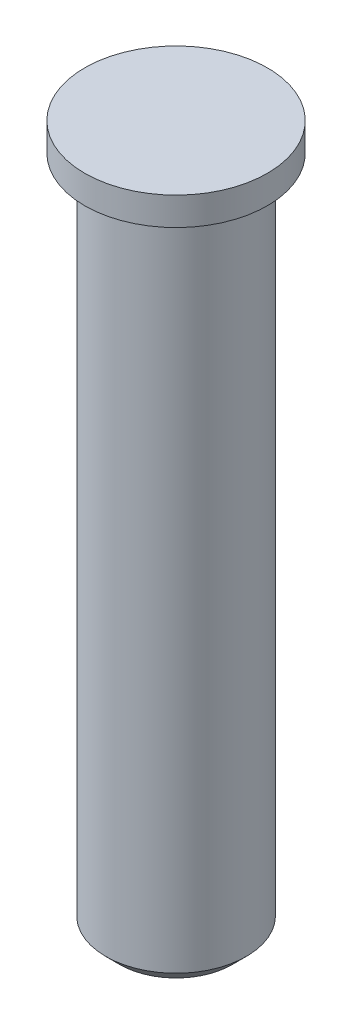
ISO-10303-21;
HEADER;
FILE_DESCRIPTION(('STEP AP214'),'2;1');
FILE_NAME('part.step','',(''),(''),'','','');
FILE_SCHEMA(('AUTOMOTIVE_DESIGN { 1 0 10303 214 1 1 1 1 }'));
ENDSEC;
DATA;
#1=APPLICATION_CONTEXT('core data for automotive mechanical design processes');
#2=APPLICATION_PROTOCOL_DEFINITION('international standard','automotive_design',2000,#1);
#3=PRODUCT_CONTEXT('',#1,'mechanical');
#4=PRODUCT('Part','Part','',(#3));
#5=PRODUCT_RELATED_PRODUCT_CATEGORY('part','',(#4));
#6=PRODUCT_DEFINITION_FORMATION('','',#4);
#7=PRODUCT_DEFINITION_CONTEXT('part definition',#1,'design');
#8=PRODUCT_DEFINITION('design','',#6,#7);
#9=PRODUCT_DEFINITION_SHAPE('','',#8);
#10=(LENGTH_UNIT() NAMED_UNIT(*) SI_UNIT(.MILLI.,.METRE.));
#11=(NAMED_UNIT(*) PLANE_ANGLE_UNIT() SI_UNIT($,.RADIAN.));
#12=(NAMED_UNIT(*) SI_UNIT($,.STERADIAN.) SOLID_ANGLE_UNIT());
#13=UNCERTAINTY_MEASURE_WITH_UNIT(LENGTH_MEASURE(1.E-05),#10,'distance_accuracy_value','');
#14=(GEOMETRIC_REPRESENTATION_CONTEXT(3) GLOBAL_UNCERTAINTY_ASSIGNED_CONTEXT((#13)) GLOBAL_UNIT_ASSIGNED_CONTEXT((#10,
#11,#12)) REPRESENTATION_CONTEXT('',''));
#15=CARTESIAN_POINT('',(0.,0.,0.));
#16=DIRECTION('',(0.,0.,1.));
#17=DIRECTION('',(1.,0.,0.));
#18=AXIS2_PLACEMENT_3D('',#15,#16,#17);
#19=CARTESIAN_POINT('',(0.,0.,0.));
#20=DIRECTION('',(0.,-1.,0.));
#21=DIRECTION('',(0.,0.,-1.));
#22=AXIS2_PLACEMENT_3D('',#19,#20,#21);
#23=PLANE('',#22);
#24=CARTESIAN_POINT('',(0.,0.,0.));
#25=DIRECTION('',(0.,1.,0.));
#26=DIRECTION('',(0.,0.,1.));
#27=AXIS2_PLACEMENT_3D('',#24,#25,#26);
#28=CIRCLE('',#27,3.25);
#29=CARTESIAN_POINT('',(0.,0.,3.25));
#30=VERTEX_POINT('',#29);
#31=EDGE_CURVE('E43',#30,#30,#28,.T.);
#32=ORIENTED_EDGE('',*,*,#31,.T.);
#33=EDGE_LOOP('',(#32));
#34=FACE_BOUND('',#33,.T.);
#35=ADVANCED_FACE('F32',(#34),#23,.F.);
#36=CARTESIAN_POINT('',(0.,0.,0.));
#37=DIRECTION('',(0.,1.,0.));
#38=DIRECTION('',(0.,0.,1.));
#39=AXIS2_PLACEMENT_3D('',#36,#37,#38);
#40=CYLINDRICAL_SURFACE('',#39,3.25);
#41=ORIENTED_EDGE('',*,*,#31,.F.);
#42=EDGE_LOOP('',(#41));
#43=FACE_BOUND('',#42,.T.);
#44=CARTESIAN_POINT('',(0.,-1.,0.));
#45=DIRECTION('',(0.,1.,0.));
#46=DIRECTION('',(0.,0.,1.));
#47=AXIS2_PLACEMENT_3D('',#44,#45,#46);
#48=CIRCLE('',#47,3.25);
#49=CARTESIAN_POINT('',(0.,-1.,3.25));
#50=VERTEX_POINT('',#49);
#51=EDGE_CURVE('E47',#50,#50,#48,.T.);
#52=ORIENTED_EDGE('',*,*,#51,.T.);
#53=EDGE_LOOP('',(#52));
#54=FACE_BOUND('',#53,.T.);
#55=ADVANCED_FACE('F67',(#43,#54),#40,.T.);
#56=CARTESIAN_POINT('',(3.25,-1.,0.));
#57=DIRECTION('',(0.,1.,0.));
#58=DIRECTION('',(0.,0.,1.));
#59=AXIS2_PLACEMENT_3D('',#56,#57,#58);
#60=PLANE('',#59);
#61=ORIENTED_EDGE('',*,*,#51,.F.);
#62=EDGE_LOOP('',(#61));
#63=FACE_BOUND('',#62,.T.);
#64=CARTESIAN_POINT('',(0.,-1.,0.));
#65=DIRECTION('',(0.,1.,0.));
#66=DIRECTION('',(0.,0.,1.));
#67=AXIS2_PLACEMENT_3D('',#64,#65,#66);
#68=CIRCLE('',#67,2.5);
#69=CARTESIAN_POINT('',(0.,-1.,2.5));
#70=VERTEX_POINT('',#69);
#71=EDGE_CURVE('E52',#70,#70,#68,.T.);
#72=ORIENTED_EDGE('',*,*,#71,.T.);
#73=EDGE_LOOP('',(#72));
#74=FACE_BOUND('',#73,.T.);
#75=ADVANCED_FACE('F56',(#63,#74),#60,.F.);
#76=CARTESIAN_POINT('',(0.,0.,0.));
#77=DIRECTION('',(0.,1.,0.));
#78=DIRECTION('',(0.,0.,1.));
#79=AXIS2_PLACEMENT_3D('',#76,#77,#78);
#80=CYLINDRICAL_SURFACE('',#79,2.5);
#81=CARTESIAN_POINT('',(0.,-24.5,0.));
#82=DIRECTION('',(0.,1.,0.));
#83=DIRECTION('',(0.,0.,1.));
#84=AXIS2_PLACEMENT_3D('',#81,#82,#83);
#85=CIRCLE('',#84,2.5);
#86=CARTESIAN_POINT('',(0.,-24.5,2.5));
#87=VERTEX_POINT('',#86);
#88=EDGE_CURVE('E39',#87,#87,#85,.T.);
#89=ORIENTED_EDGE('',*,*,#88,.T.);
#90=EDGE_LOOP('',(#89));
#91=FACE_BOUND('',#90,.T.);
#92=ORIENTED_EDGE('',*,*,#71,.F.);
#93=EDGE_LOOP('',(#92));
#94=FACE_BOUND('',#93,.T.);
#95=ADVANCED_FACE('F58',(#91,#94),#80,.T.);
#96=CARTESIAN_POINT('',(2.5,-25.,0.));
#97=DIRECTION('',(0.,1.,0.));
#98=DIRECTION('',(0.,0.,1.));
#99=AXIS2_PLACEMENT_3D('',#96,#97,#98);
#100=PLANE('',#99);
#101=CARTESIAN_POINT('',(0.,-25.,0.));
#102=DIRECTION('',(0.,1.,0.));
#103=DIRECTION('',(0.,0.,1.));
#104=AXIS2_PLACEMENT_3D('',#101,#102,#103);
#105=CIRCLE('',#104,2.);
#106=CARTESIAN_POINT('',(0.,-25.,2.));
#107=VERTEX_POINT('',#106);
#108=EDGE_CURVE('E10',#107,#107,#105,.F.);
#109=ORIENTED_EDGE('',*,*,#108,.T.);
#110=EDGE_LOOP('',(#109));
#111=FACE_BOUND('',#110,.T.);
#112=ADVANCED_FACE('F60',(#111),#100,.F.);
#113=CARTESIAN_POINT('',(0.,-24.5,0.));
#114=DIRECTION('',(0.,1.,0.));
#115=DIRECTION('',(0.,0.,1.));
#116=AXIS2_PLACEMENT_3D('',#113,#114,#115);
#117=CONICAL_SURFACE('',#116,2.5,0.785398163397455);
#118=ORIENTED_EDGE('',*,*,#108,.F.);
#119=EDGE_LOOP('',(#118));
#120=FACE_BOUND('',#119,.T.);
#121=ORIENTED_EDGE('',*,*,#88,.F.);
#122=EDGE_LOOP('',(#121));
#123=FACE_BOUND('',#122,.T.);
#124=ADVANCED_FACE('F34',(#120,#123),#117,.T.);
#125=CLOSED_SHELL('',(#35,#55,#75,#95,#112,#124));
#126=MANIFOLD_SOLID_BREP('B2',#125);
#127=ADVANCED_BREP_SHAPE_REPRESENTATION('',(#18,#126),#14);
#128=SHAPE_DEFINITION_REPRESENTATION(#9,#127);
ENDSEC;
END-ISO-10303-21;
